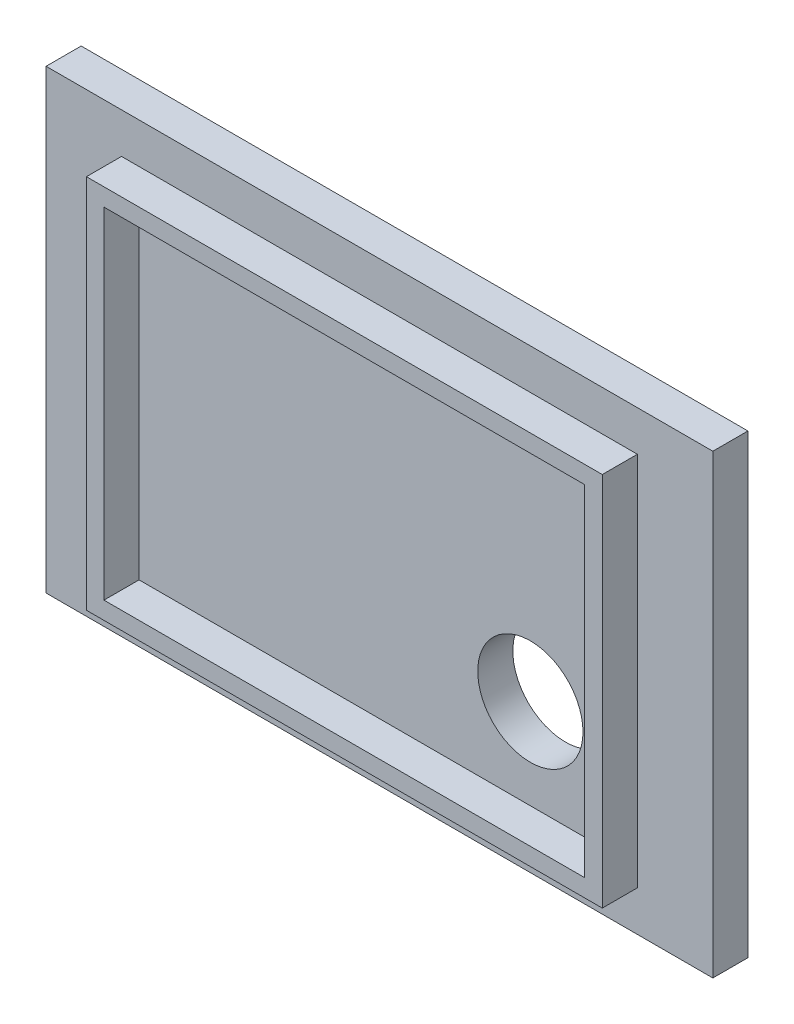
ISO-10303-21;
HEADER;
FILE_DESCRIPTION(('STEP AP214'),'2;1');
FILE_NAME('part.step','',(''),(''),'','','');
FILE_SCHEMA(('AUTOMOTIVE_DESIGN { 1 0 10303 214 1 1 1 1 }'));
ENDSEC;
DATA;
#1=APPLICATION_CONTEXT('core data for automotive mechanical design processes');
#2=APPLICATION_PROTOCOL_DEFINITION('international standard','automotive_design',2000,#1);
#3=PRODUCT_CONTEXT('',#1,'mechanical');
#4=PRODUCT('Part','Part','',(#3));
#5=PRODUCT_RELATED_PRODUCT_CATEGORY('part','',(#4));
#6=PRODUCT_DEFINITION_FORMATION('','',#4);
#7=PRODUCT_DEFINITION_CONTEXT('part definition',#1,'design');
#8=PRODUCT_DEFINITION('design','',#6,#7);
#9=PRODUCT_DEFINITION_SHAPE('','',#8);
#10=(LENGTH_UNIT() NAMED_UNIT(*) SI_UNIT(.MILLI.,.METRE.));
#11=(NAMED_UNIT(*) PLANE_ANGLE_UNIT() SI_UNIT($,.RADIAN.));
#12=(NAMED_UNIT(*) SI_UNIT($,.STERADIAN.) SOLID_ANGLE_UNIT());
#13=UNCERTAINTY_MEASURE_WITH_UNIT(LENGTH_MEASURE(1.E-05),#10,'distance_accuracy_value','');
#14=(GEOMETRIC_REPRESENTATION_CONTEXT(3) GLOBAL_UNCERTAINTY_ASSIGNED_CONTEXT((#13)) GLOBAL_UNIT_ASSIGNED_CONTEXT((#10,
#11,#12)) REPRESENTATION_CONTEXT('',''));
#15=CARTESIAN_POINT('',(0.,0.,0.));
#16=DIRECTION('',(0.,0.,1.));
#17=DIRECTION('',(1.,0.,0.));
#18=AXIS2_PLACEMENT_3D('',#15,#16,#17);
#19=CARTESIAN_POINT('',(0.,0.,2.));
#20=DIRECTION('',(0.,0.,1.));
#21=DIRECTION('',(1.,0.,0.));
#22=AXIS2_PLACEMENT_3D('',#19,#20,#21);
#23=PLANE('',#22);
#24=DIRECTION('',(0.,1.,0.));
#25=VECTOR('',#24,1.);
#26=CARTESIAN_POINT('',(-19.,0.,2.));
#27=LINE('',#26,#25);
#28=CARTESIAN_POINT('',(-19.,-13.,2.));
#29=VERTEX_POINT('',#28);
#30=CARTESIAN_POINT('',(-19.,13.,2.));
#31=VERTEX_POINT('',#30);
#32=EDGE_CURVE('E193',#29,#31,#27,.T.);
#33=ORIENTED_EDGE('',*,*,#32,.F.);
#34=DIRECTION('',(-1.,0.,0.));
#35=VECTOR('',#34,1.);
#36=CARTESIAN_POINT('',(0.,-13.,2.));
#37=LINE('',#36,#35);
#38=CARTESIAN_POINT('',(19.,-13.,2.));
#39=VERTEX_POINT('',#38);
#40=EDGE_CURVE('E196',#39,#29,#37,.T.);
#41=ORIENTED_EDGE('',*,*,#40,.F.);
#42=DIRECTION('',(0.,1.,0.));
#43=VECTOR('',#42,1.);
#44=CARTESIAN_POINT('',(19.,0.,2.));
#45=LINE('',#44,#43);
#46=CARTESIAN_POINT('',(19.,13.,2.));
#47=VERTEX_POINT('',#46);
#48=EDGE_CURVE('E200',#39,#47,#45,.T.);
#49=ORIENTED_EDGE('',*,*,#48,.T.);
#50=DIRECTION('',(-1.,0.,0.));
#51=VECTOR('',#50,1.);
#52=CARTESIAN_POINT('',(0.,13.,2.));
#53=LINE('',#52,#51);
#54=EDGE_CURVE('E202',#47,#31,#53,.T.);
#55=ORIENTED_EDGE('',*,*,#54,.T.);
#56=EDGE_LOOP('',(#33,#41,#49,#55));
#57=FACE_BOUND('',#56,.T.);
#58=DIRECTION('',(-1.,0.,0.));
#59=VECTOR('',#58,1.);
#60=CARTESIAN_POINT('',(-14.7,10.7,2.));
#61=LINE('',#60,#59);
#62=CARTESIAN_POINT('',(14.7,10.7,2.));
#63=VERTEX_POINT('',#62);
#64=CARTESIAN_POINT('',(-14.7,10.7,2.));
#65=VERTEX_POINT('',#64);
#66=EDGE_CURVE('E179',#63,#65,#61,.T.);
#67=ORIENTED_EDGE('',*,*,#66,.F.);
#68=DIRECTION('',(0.,1.,0.));
#69=VECTOR('',#68,1.);
#70=CARTESIAN_POINT('',(14.7,-10.7,2.));
#71=LINE('',#70,#69);
#72=CARTESIAN_POINT('',(14.7,-10.7,2.));
#73=VERTEX_POINT('',#72);
#74=EDGE_CURVE('E142',#73,#63,#71,.T.);
#75=ORIENTED_EDGE('',*,*,#74,.F.);
#76=DIRECTION('',(1.,0.,0.));
#77=VECTOR('',#76,1.);
#78=CARTESIAN_POINT('',(-14.7,-10.7,2.));
#79=LINE('',#78,#77);
#80=CARTESIAN_POINT('',(-14.7,-10.7,2.));
#81=VERTEX_POINT('',#80);
#82=EDGE_CURVE('E170',#81,#73,#79,.T.);
#83=ORIENTED_EDGE('',*,*,#82,.F.);
#84=DIRECTION('',(0.,-1.,0.));
#85=VECTOR('',#84,1.);
#86=CARTESIAN_POINT('',(-14.7,-10.7,2.));
#87=LINE('',#86,#85);
#88=EDGE_CURVE('E181',#65,#81,#87,.T.);
#89=ORIENTED_EDGE('',*,*,#88,.F.);
#90=EDGE_LOOP('',(#67,#75,#83,#89));
#91=FACE_BOUND('',#90,.T.);
#92=ADVANCED_FACE('F35',(#57,#91),#23,.T.);
#93=CARTESIAN_POINT('',(-19.,0.,2.));
#94=DIRECTION('',(-1.,0.,0.));
#95=DIRECTION('',(0.,0.,1.));
#96=AXIS2_PLACEMENT_3D('',#93,#94,#95);
#97=PLANE('',#96);
#98=DIRECTION('',(0.,1.,0.));
#99=VECTOR('',#98,1.);
#100=CARTESIAN_POINT('',(-19.,0.,0.));
#101=LINE('',#100,#99);
#102=CARTESIAN_POINT('',(-19.,-13.,0.));
#103=VERTEX_POINT('',#102);
#104=CARTESIAN_POINT('',(-19.,13.,0.));
#105=VERTEX_POINT('',#104);
#106=EDGE_CURVE('E192',#103,#105,#101,.T.);
#107=ORIENTED_EDGE('',*,*,#106,.F.);
#108=DIRECTION('',(0.,0.,-1.));
#109=VECTOR('',#108,1.);
#110=CARTESIAN_POINT('',(-19.,-13.,2.));
#111=LINE('',#110,#109);
#112=EDGE_CURVE('E11',#29,#103,#111,.T.);
#113=ORIENTED_EDGE('',*,*,#112,.F.);
#114=ORIENTED_EDGE('',*,*,#32,.T.);
#115=DIRECTION('',(0.,0.,-1.));
#116=VECTOR('',#115,1.);
#117=CARTESIAN_POINT('',(-19.,13.,2.));
#118=LINE('',#117,#116);
#119=EDGE_CURVE('E204',#31,#105,#118,.T.);
#120=ORIENTED_EDGE('',*,*,#119,.T.);
#121=EDGE_LOOP('',(#107,#113,#114,#120));
#122=FACE_BOUND('',#121,.T.);
#123=ADVANCED_FACE('F37',(#122),#97,.T.);
#124=CARTESIAN_POINT('',(0.,-13.,2.));
#125=DIRECTION('',(0.,-1.,0.));
#126=DIRECTION('',(0.,0.,-1.));
#127=AXIS2_PLACEMENT_3D('',#124,#125,#126);
#128=PLANE('',#127);
#129=DIRECTION('',(-1.,0.,0.));
#130=VECTOR('',#129,1.);
#131=CARTESIAN_POINT('',(0.,-13.,0.));
#132=LINE('',#131,#130);
#133=CARTESIAN_POINT('',(19.,-13.,0.));
#134=VERTEX_POINT('',#133);
#135=EDGE_CURVE('E207',#134,#103,#132,.T.);
#136=ORIENTED_EDGE('',*,*,#135,.F.);
#137=DIRECTION('',(0.,0.,-1.));
#138=VECTOR('',#137,1.);
#139=CARTESIAN_POINT('',(19.,-13.,2.));
#140=LINE('',#139,#138);
#141=EDGE_CURVE('E43',#39,#134,#140,.T.);
#142=ORIENTED_EDGE('',*,*,#141,.F.);
#143=ORIENTED_EDGE('',*,*,#40,.T.);
#144=ORIENTED_EDGE('',*,*,#112,.T.);
#145=EDGE_LOOP('',(#136,#142,#143,#144));
#146=FACE_BOUND('',#145,.T.);
#147=ADVANCED_FACE('F228',(#146),#128,.T.);
#148=CARTESIAN_POINT('',(19.,0.,2.));
#149=DIRECTION('',(-1.,0.,0.));
#150=DIRECTION('',(0.,0.,1.));
#151=AXIS2_PLACEMENT_3D('',#148,#149,#150);
#152=PLANE('',#151);
#153=DIRECTION('',(0.,1.,0.));
#154=VECTOR('',#153,1.);
#155=CARTESIAN_POINT('',(19.,0.,0.));
#156=LINE('',#155,#154);
#157=CARTESIAN_POINT('',(19.,13.,0.));
#158=VERTEX_POINT('',#157);
#159=EDGE_CURVE('E210',#134,#158,#156,.T.);
#160=ORIENTED_EDGE('',*,*,#159,.T.);
#161=DIRECTION('',(0.,0.,-1.));
#162=VECTOR('',#161,1.);
#163=CARTESIAN_POINT('',(19.,13.,2.));
#164=LINE('',#163,#162);
#165=EDGE_CURVE('E215',#47,#158,#164,.T.);
#166=ORIENTED_EDGE('',*,*,#165,.F.);
#167=ORIENTED_EDGE('',*,*,#48,.F.);
#168=ORIENTED_EDGE('',*,*,#141,.T.);
#169=EDGE_LOOP('',(#160,#166,#167,#168));
#170=FACE_BOUND('',#169,.T.);
#171=ADVANCED_FACE('F220',(#170),#152,.F.);
#172=CARTESIAN_POINT('',(0.,13.,2.));
#173=DIRECTION('',(0.,-1.,0.));
#174=DIRECTION('',(0.,0.,-1.));
#175=AXIS2_PLACEMENT_3D('',#172,#173,#174);
#176=PLANE('',#175);
#177=DIRECTION('',(-1.,0.,0.));
#178=VECTOR('',#177,1.);
#179=CARTESIAN_POINT('',(0.,13.,0.));
#180=LINE('',#179,#178);
#181=EDGE_CURVE('E197',#158,#105,#180,.T.);
#182=ORIENTED_EDGE('',*,*,#181,.T.);
#183=ORIENTED_EDGE('',*,*,#119,.F.);
#184=ORIENTED_EDGE('',*,*,#54,.F.);
#185=ORIENTED_EDGE('',*,*,#165,.T.);
#186=EDGE_LOOP('',(#182,#183,#184,#185));
#187=FACE_BOUND('',#186,.T.);
#188=ADVANCED_FACE('F235',(#187),#176,.F.);
#189=CARTESIAN_POINT('',(0.,0.,0.));
#190=DIRECTION('',(0.,0.,1.));
#191=DIRECTION('',(1.,0.,0.));
#192=AXIS2_PLACEMENT_3D('',#189,#190,#191);
#193=PLANE('',#192);
#194=CARTESIAN_POINT('',(8.60084285462648,-4.55695078576213,0.));
#195=DIRECTION('',(0.,0.,1.));
#196=DIRECTION('',(1.,0.,0.));
#197=AXIS2_PLACEMENT_3D('',#194,#195,#196);
#198=CIRCLE('',#197,3.);
#199=CARTESIAN_POINT('',(11.6008428546265,-4.55695078576213,0.));
#200=VERTEX_POINT('',#199);
#201=EDGE_CURVE('E156',#200,#200,#198,.T.);
#202=ORIENTED_EDGE('',*,*,#201,.T.);
#203=EDGE_LOOP('',(#202));
#204=FACE_BOUND('',#203,.T.);
#205=ORIENTED_EDGE('',*,*,#106,.T.);
#206=ORIENTED_EDGE('',*,*,#181,.F.);
#207=ORIENTED_EDGE('',*,*,#159,.F.);
#208=ORIENTED_EDGE('',*,*,#135,.T.);
#209=EDGE_LOOP('',(#205,#206,#207,#208));
#210=FACE_BOUND('',#209,.T.);
#211=ADVANCED_FACE('F227',(#204,#210),#193,.F.);
#212=CARTESIAN_POINT('',(0.,0.,4.));
#213=DIRECTION('',(0.,0.,-1.));
#214=DIRECTION('',(-1.,0.,0.));
#215=AXIS2_PLACEMENT_3D('',#212,#213,#214);
#216=PLANE('',#215);
#217=DIRECTION('',(0.,1.,0.));
#218=VECTOR('',#217,1.);
#219=CARTESIAN_POINT('',(14.7,-10.7,4.));
#220=LINE('',#219,#218);
#221=CARTESIAN_POINT('',(14.7,-10.7,4.));
#222=VERTEX_POINT('',#221);
#223=CARTESIAN_POINT('',(14.7,10.7,4.));
#224=VERTEX_POINT('',#223);
#225=EDGE_CURVE('E166',#222,#224,#220,.T.);
#226=ORIENTED_EDGE('',*,*,#225,.T.);
#227=DIRECTION('',(-1.,0.,0.));
#228=VECTOR('',#227,1.);
#229=CARTESIAN_POINT('',(-14.7,10.7,4.));
#230=LINE('',#229,#228);
#231=CARTESIAN_POINT('',(-14.7,10.7,4.));
#232=VERTEX_POINT('',#231);
#233=EDGE_CURVE('E169',#224,#232,#230,.T.);
#234=ORIENTED_EDGE('',*,*,#233,.T.);
#235=DIRECTION('',(0.,-1.,0.));
#236=VECTOR('',#235,1.);
#237=CARTESIAN_POINT('',(-14.7,-10.7,4.));
#238=LINE('',#237,#236);
#239=CARTESIAN_POINT('',(-14.7,-10.7,4.));
#240=VERTEX_POINT('',#239);
#241=EDGE_CURVE('E172',#232,#240,#238,.T.);
#242=ORIENTED_EDGE('',*,*,#241,.T.);
#243=DIRECTION('',(1.,0.,0.));
#244=VECTOR('',#243,1.);
#245=CARTESIAN_POINT('',(-14.7,-10.7,4.));
#246=LINE('',#245,#244);
#247=EDGE_CURVE('E174',#240,#222,#246,.T.);
#248=ORIENTED_EDGE('',*,*,#247,.T.);
#249=EDGE_LOOP('',(#226,#234,#242,#248));
#250=FACE_BOUND('',#249,.T.);
#251=DIRECTION('',(0.,-1.,0.));
#252=VECTOR('',#251,1.);
#253=CARTESIAN_POINT('',(-13.7,-9.7,4.));
#254=LINE('',#253,#252);
#255=CARTESIAN_POINT('',(-13.7,9.7,4.));
#256=VERTEX_POINT('',#255);
#257=CARTESIAN_POINT('',(-13.7,-9.7,4.));
#258=VERTEX_POINT('',#257);
#259=EDGE_CURVE('E125',#256,#258,#254,.T.);
#260=ORIENTED_EDGE('',*,*,#259,.F.);
#261=DIRECTION('',(-1.,0.,0.));
#262=VECTOR('',#261,1.);
#263=CARTESIAN_POINT('',(-13.7,9.7,4.));
#264=LINE('',#263,#262);
#265=CARTESIAN_POINT('',(13.7,9.7,4.));
#266=VERTEX_POINT('',#265);
#267=EDGE_CURVE('E150',#266,#256,#264,.T.);
#268=ORIENTED_EDGE('',*,*,#267,.F.);
#269=DIRECTION('',(0.,1.,0.));
#270=VECTOR('',#269,1.);
#271=CARTESIAN_POINT('',(13.7,-9.7,4.));
#272=LINE('',#271,#270);
#273=CARTESIAN_POINT('',(13.7,-9.7,4.));
#274=VERTEX_POINT('',#273);
#275=EDGE_CURVE('E148',#274,#266,#272,.T.);
#276=ORIENTED_EDGE('',*,*,#275,.F.);
#277=DIRECTION('',(1.,0.,0.));
#278=VECTOR('',#277,1.);
#279=CARTESIAN_POINT('',(-13.7,-9.7,4.));
#280=LINE('',#279,#278);
#281=EDGE_CURVE('E134',#258,#274,#280,.T.);
#282=ORIENTED_EDGE('',*,*,#281,.F.);
#283=EDGE_LOOP('',(#260,#268,#276,#282));
#284=FACE_BOUND('',#283,.T.);
#285=ADVANCED_FACE('F146',(#250,#284),#216,.F.);
#286=CARTESIAN_POINT('',(14.7,-10.7,4.));
#287=DIRECTION('',(-1.,0.,0.));
#288=DIRECTION('',(0.,0.,1.));
#289=AXIS2_PLACEMENT_3D('',#286,#287,#288);
#290=PLANE('',#289);
#291=ORIENTED_EDGE('',*,*,#74,.T.);
#292=DIRECTION('',(0.,0.,-1.));
#293=VECTOR('',#292,1.);
#294=CARTESIAN_POINT('',(14.7,10.7,4.));
#295=LINE('',#294,#293);
#296=EDGE_CURVE('E190',#224,#63,#295,.T.);
#297=ORIENTED_EDGE('',*,*,#296,.F.);
#298=ORIENTED_EDGE('',*,*,#225,.F.);
#299=DIRECTION('',(0.,0.,-1.));
#300=VECTOR('',#299,1.);
#301=CARTESIAN_POINT('',(14.7,-10.7,4.));
#302=LINE('',#301,#300);
#303=EDGE_CURVE('E176',#222,#73,#302,.T.);
#304=ORIENTED_EDGE('',*,*,#303,.T.);
#305=EDGE_LOOP('',(#291,#297,#298,#304));
#306=FACE_BOUND('',#305,.T.);
#307=ADVANCED_FACE('F256',(#306),#290,.F.);
#308=CARTESIAN_POINT('',(-14.7,10.7,4.));
#309=DIRECTION('',(0.,-1.,0.));
#310=DIRECTION('',(0.,0.,-1.));
#311=AXIS2_PLACEMENT_3D('',#308,#309,#310);
#312=PLANE('',#311);
#313=ORIENTED_EDGE('',*,*,#66,.T.);
#314=DIRECTION('',(0.,0.,-1.));
#315=VECTOR('',#314,1.);
#316=CARTESIAN_POINT('',(-14.7,10.7,4.));
#317=LINE('',#316,#315);
#318=EDGE_CURVE('E187',#232,#65,#317,.T.);
#319=ORIENTED_EDGE('',*,*,#318,.F.);
#320=ORIENTED_EDGE('',*,*,#233,.F.);
#321=ORIENTED_EDGE('',*,*,#296,.T.);
#322=EDGE_LOOP('',(#313,#319,#320,#321));
#323=FACE_BOUND('',#322,.T.);
#324=ADVANCED_FACE('F247',(#323),#312,.F.);
#325=CARTESIAN_POINT('',(-14.7,-10.7,4.));
#326=DIRECTION('',(1.,0.,0.));
#327=DIRECTION('',(0.,0.,-1.));
#328=AXIS2_PLACEMENT_3D('',#325,#326,#327);
#329=PLANE('',#328);
#330=ORIENTED_EDGE('',*,*,#88,.T.);
#331=DIRECTION('',(0.,0.,-1.));
#332=VECTOR('',#331,1.);
#333=CARTESIAN_POINT('',(-14.7,-10.7,4.));
#334=LINE('',#333,#332);
#335=EDGE_CURVE('E50',#240,#81,#334,.T.);
#336=ORIENTED_EDGE('',*,*,#335,.F.);
#337=ORIENTED_EDGE('',*,*,#241,.F.);
#338=ORIENTED_EDGE('',*,*,#318,.T.);
#339=EDGE_LOOP('',(#330,#336,#337,#338));
#340=FACE_BOUND('',#339,.T.);
#341=ADVANCED_FACE('F251',(#340),#329,.F.);
#342=CARTESIAN_POINT('',(-14.7,-10.7,4.));
#343=DIRECTION('',(0.,1.,0.));
#344=DIRECTION('',(0.,0.,1.));
#345=AXIS2_PLACEMENT_3D('',#342,#343,#344);
#346=PLANE('',#345);
#347=ORIENTED_EDGE('',*,*,#82,.T.);
#348=ORIENTED_EDGE('',*,*,#303,.F.);
#349=ORIENTED_EDGE('',*,*,#247,.F.);
#350=ORIENTED_EDGE('',*,*,#335,.T.);
#351=EDGE_LOOP('',(#347,#348,#349,#350));
#352=FACE_BOUND('',#351,.T.);
#353=ADVANCED_FACE('F257',(#352),#346,.F.);
#354=CARTESIAN_POINT('',(-13.7,-9.7,4.));
#355=DIRECTION('',(1.,0.,0.));
#356=DIRECTION('',(0.,0.,-1.));
#357=AXIS2_PLACEMENT_3D('',#354,#355,#356);
#358=PLANE('',#357);
#359=DIRECTION('',(0.,-1.,0.));
#360=VECTOR('',#359,1.);
#361=CARTESIAN_POINT('',(-13.7,-9.7,2.));
#362=LINE('',#361,#360);
#363=CARTESIAN_POINT('',(-13.7,9.7,2.));
#364=VERTEX_POINT('',#363);
#365=CARTESIAN_POINT('',(-13.7,-9.7,2.));
#366=VERTEX_POINT('',#365);
#367=EDGE_CURVE('E58',#364,#366,#362,.T.);
#368=ORIENTED_EDGE('',*,*,#367,.F.);
#369=DIRECTION('',(0.,0.,-1.));
#370=VECTOR('',#369,1.);
#371=CARTESIAN_POINT('',(-13.7,9.7,4.));
#372=LINE('',#371,#370);
#373=EDGE_CURVE('E130',#256,#364,#372,.T.);
#374=ORIENTED_EDGE('',*,*,#373,.F.);
#375=ORIENTED_EDGE('',*,*,#259,.T.);
#376=DIRECTION('',(0.,0.,-1.));
#377=VECTOR('',#376,1.);
#378=CARTESIAN_POINT('',(-13.7,-9.7,4.));
#379=LINE('',#378,#377);
#380=EDGE_CURVE('E128',#258,#366,#379,.T.);
#381=ORIENTED_EDGE('',*,*,#380,.T.);
#382=EDGE_LOOP('',(#368,#374,#375,#381));
#383=FACE_BOUND('',#382,.T.);
#384=ADVANCED_FACE('F127',(#383),#358,.T.);
#385=CARTESIAN_POINT('',(-13.7,-9.7,4.));
#386=DIRECTION('',(0.,1.,0.));
#387=DIRECTION('',(0.,0.,1.));
#388=AXIS2_PLACEMENT_3D('',#385,#386,#387);
#389=PLANE('',#388);
#390=DIRECTION('',(1.,0.,0.));
#391=VECTOR('',#390,1.);
#392=CARTESIAN_POINT('',(-13.7,-9.7,2.));
#393=LINE('',#392,#391);
#394=CARTESIAN_POINT('',(13.7,-9.7,2.));
#395=VERTEX_POINT('',#394);
#396=EDGE_CURVE('E141',#366,#395,#393,.T.);
#397=ORIENTED_EDGE('',*,*,#396,.F.);
#398=ORIENTED_EDGE('',*,*,#380,.F.);
#399=ORIENTED_EDGE('',*,*,#281,.T.);
#400=DIRECTION('',(0.,0.,-1.));
#401=VECTOR('',#400,1.);
#402=CARTESIAN_POINT('',(13.7,-9.7,4.));
#403=LINE('',#402,#401);
#404=EDGE_CURVE('E143',#274,#395,#403,.T.);
#405=ORIENTED_EDGE('',*,*,#404,.T.);
#406=EDGE_LOOP('',(#397,#398,#399,#405));
#407=FACE_BOUND('',#406,.T.);
#408=ADVANCED_FACE('F138',(#407),#389,.T.);
#409=CARTESIAN_POINT('',(13.7,-9.7,4.));
#410=DIRECTION('',(-1.,0.,0.));
#411=DIRECTION('',(0.,0.,1.));
#412=AXIS2_PLACEMENT_3D('',#409,#410,#411);
#413=PLANE('',#412);
#414=DIRECTION('',(0.,1.,0.));
#415=VECTOR('',#414,1.);
#416=CARTESIAN_POINT('',(13.7,-9.7,2.));
#417=LINE('',#416,#415);
#418=CARTESIAN_POINT('',(13.7,9.7,2.));
#419=VERTEX_POINT('',#418);
#420=EDGE_CURVE('E158',#395,#419,#417,.T.);
#421=ORIENTED_EDGE('',*,*,#420,.F.);
#422=ORIENTED_EDGE('',*,*,#404,.F.);
#423=ORIENTED_EDGE('',*,*,#275,.T.);
#424=DIRECTION('',(0.,0.,-1.));
#425=VECTOR('',#424,1.);
#426=CARTESIAN_POINT('',(13.7,9.7,4.));
#427=LINE('',#426,#425);
#428=EDGE_CURVE('E162',#266,#419,#427,.T.);
#429=ORIENTED_EDGE('',*,*,#428,.T.);
#430=EDGE_LOOP('',(#421,#422,#423,#429));
#431=FACE_BOUND('',#430,.T.);
#432=ADVANCED_FACE('F341',(#431),#413,.T.);
#433=CARTESIAN_POINT('',(-13.7,9.7,4.));
#434=DIRECTION('',(0.,-1.,0.));
#435=DIRECTION('',(0.,0.,-1.));
#436=AXIS2_PLACEMENT_3D('',#433,#434,#435);
#437=PLANE('',#436);
#438=DIRECTION('',(-1.,0.,0.));
#439=VECTOR('',#438,1.);
#440=CARTESIAN_POINT('',(-13.7,9.7,2.));
#441=LINE('',#440,#439);
#442=EDGE_CURVE('E135',#419,#364,#441,.T.);
#443=ORIENTED_EDGE('',*,*,#442,.F.);
#444=ORIENTED_EDGE('',*,*,#428,.F.);
#445=ORIENTED_EDGE('',*,*,#267,.T.);
#446=ORIENTED_EDGE('',*,*,#373,.T.);
#447=EDGE_LOOP('',(#443,#444,#445,#446));
#448=FACE_BOUND('',#447,.T.);
#449=ADVANCED_FACE('F274',(#448),#437,.T.);
#450=CARTESIAN_POINT('',(8.60084285462648,-4.55695078576213,2.));
#451=DIRECTION('',(0.,0.,1.));
#452=DIRECTION('',(1.,0.,0.));
#453=AXIS2_PLACEMENT_3D('',#450,#451,#452);
#454=CIRCLE('',#453,3.);
#455=CARTESIAN_POINT('',(11.6008428546265,-4.55695078576213,2.));
#456=VERTEX_POINT('',#455);
#457=EDGE_CURVE('E388',#456,#456,#454,.T.);
#458=ORIENTED_EDGE('',*,*,#457,.F.);
#459=EDGE_LOOP('',(#458));
#460=FACE_BOUND('',#459,.T.);
#461=ORIENTED_EDGE('',*,*,#367,.T.);
#462=ORIENTED_EDGE('',*,*,#396,.T.);
#463=ORIENTED_EDGE('',*,*,#420,.T.);
#464=ORIENTED_EDGE('',*,*,#442,.T.);
#465=EDGE_LOOP('',(#461,#462,#463,#464));
#466=FACE_BOUND('',#465,.T.);
#467=ADVANCED_FACE('F240',(#460,#466),#23,.T.);
#468=CARTESIAN_POINT('',(8.60084285462648,-4.55695078576213,0.));
#469=DIRECTION('',(0.,0.,1.));
#470=DIRECTION('',(1.,0.,0.));
#471=AXIS2_PLACEMENT_3D('',#468,#469,#470);
#472=CYLINDRICAL_SURFACE('',#471,3.);
#473=ORIENTED_EDGE('',*,*,#201,.F.);
#474=EDGE_LOOP('',(#473));
#475=FACE_BOUND('',#474,.T.);
#476=ORIENTED_EDGE('',*,*,#457,.T.);
#477=EDGE_LOOP('',(#476));
#478=FACE_BOUND('',#477,.T.);
#479=ADVANCED_FACE('F273',(#475,#478),#472,.F.);
#480=CLOSED_SHELL('',(#92,#123,#147,#171,#188,#211,#285,#307,#324,#341,#353,#384,#408,#432,#449,
#467,#479));
#481=MANIFOLD_SOLID_BREP('B2',#480);
#482=ADVANCED_BREP_SHAPE_REPRESENTATION('',(#18,#481),#14);
#483=SHAPE_DEFINITION_REPRESENTATION(#9,#482);
ENDSEC;
END-ISO-10303-21;
